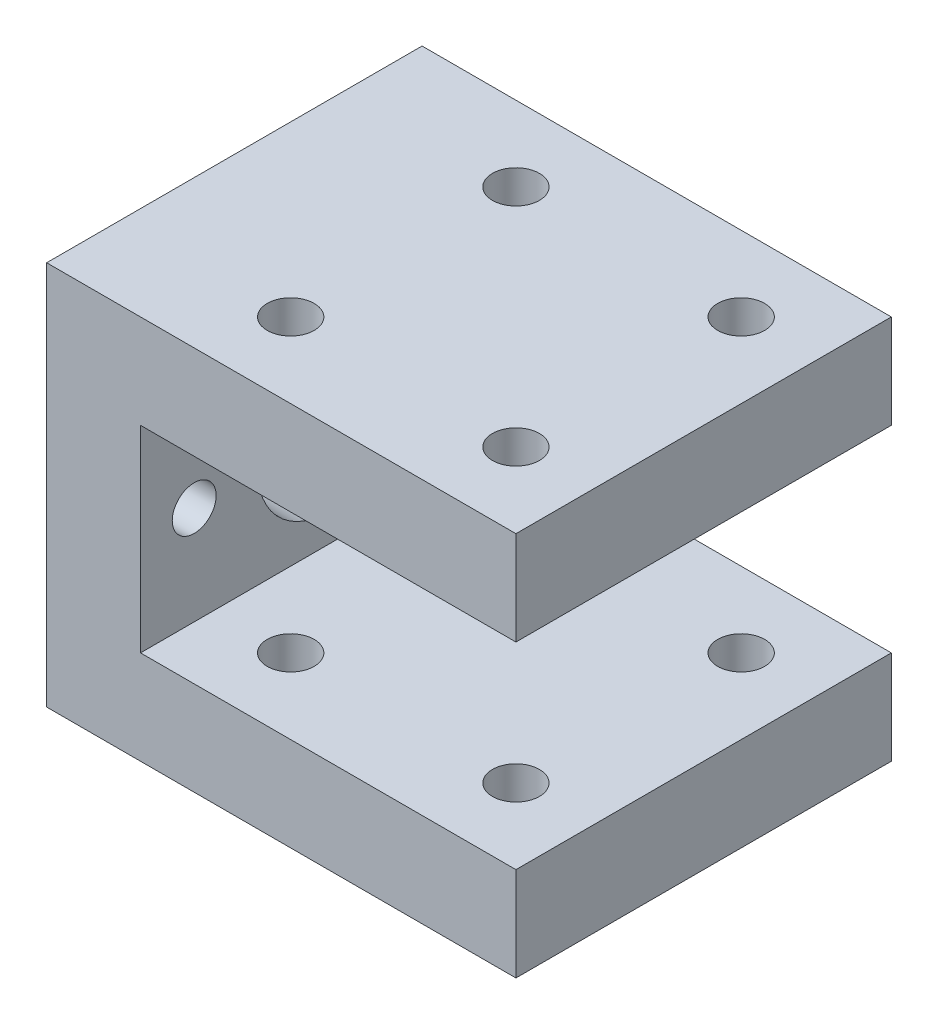
ISO-10303-21;
HEADER;
FILE_DESCRIPTION(('STEP AP214'),'2;1');
FILE_NAME('part.step','',(''),(''),'','','');
FILE_SCHEMA(('AUTOMOTIVE_DESIGN { 1 0 10303 214 1 1 1 1 }'));
ENDSEC;
DATA;
#1=APPLICATION_CONTEXT('core data for automotive mechanical design processes');
#2=APPLICATION_PROTOCOL_DEFINITION('international standard','automotive_design',2000,#1);
#3=PRODUCT_CONTEXT('',#1,'mechanical');
#4=PRODUCT('Part','Part','',(#3));
#5=PRODUCT_RELATED_PRODUCT_CATEGORY('part','',(#4));
#6=PRODUCT_DEFINITION_FORMATION('','',#4);
#7=PRODUCT_DEFINITION_CONTEXT('part definition',#1,'design');
#8=PRODUCT_DEFINITION('design','',#6,#7);
#9=PRODUCT_DEFINITION_SHAPE('','',#8);
#10=(LENGTH_UNIT() NAMED_UNIT(*) SI_UNIT(.MILLI.,.METRE.));
#11=(NAMED_UNIT(*) PLANE_ANGLE_UNIT() SI_UNIT($,.RADIAN.));
#12=(NAMED_UNIT(*) SI_UNIT($,.STERADIAN.) SOLID_ANGLE_UNIT());
#13=UNCERTAINTY_MEASURE_WITH_UNIT(LENGTH_MEASURE(1.E-05),#10,'distance_accuracy_value','');
#14=(GEOMETRIC_REPRESENTATION_CONTEXT(3) GLOBAL_UNCERTAINTY_ASSIGNED_CONTEXT((#13)) GLOBAL_UNIT_ASSIGNED_CONTEXT((#10,
#11,#12)) REPRESENTATION_CONTEXT('',''));
#15=CARTESIAN_POINT('',(0.,0.,0.));
#16=DIRECTION('',(0.,0.,1.));
#17=DIRECTION('',(1.,0.,0.));
#18=AXIS2_PLACEMENT_3D('',#15,#16,#17);
#19=CARTESIAN_POINT('',(10.,-21.,0.));
#20=DIRECTION('',(-1.,0.,0.));
#21=DIRECTION('',(0.,0.,1.));
#22=AXIS2_PLACEMENT_3D('',#19,#20,#21);
#23=PLANE('',#22);
#24=CARTESIAN_POINT('',(10.,-10.5,-20.));
#25=DIRECTION('',(-1.,0.,0.));
#26=DIRECTION('',(0.,0.,1.));
#27=AXIS2_PLACEMENT_3D('',#24,#25,#26);
#28=CIRCLE('',#27,7.5);
#29=CARTESIAN_POINT('',(10.,-10.5,-12.5));
#30=VERTEX_POINT('',#29);
#31=EDGE_CURVE('E136',#30,#30,#28,.T.);
#32=ORIENTED_EDGE('',*,*,#31,.T.);
#33=EDGE_LOOP('',(#32));
#34=FACE_BOUND('',#33,.T.);
#35=DIRECTION('',(0.,0.,1.));
#36=VECTOR('',#35,1.);
#37=CARTESIAN_POINT('',(10.,-21.,0.));
#38=LINE('',#37,#36);
#39=CARTESIAN_POINT('',(10.,-21.,-40.));
#40=VERTEX_POINT('',#39);
#41=CARTESIAN_POINT('',(10.,-21.,0.));
#42=VERTEX_POINT('',#41);
#43=EDGE_CURVE('E134',#40,#42,#38,.T.);
#44=ORIENTED_EDGE('',*,*,#43,.F.);
#45=DIRECTION('',(0.,1.,0.));
#46=VECTOR('',#45,1.);
#47=CARTESIAN_POINT('',(10.,-21.,-40.));
#48=LINE('',#47,#46);
#49=CARTESIAN_POINT('',(10.,0.,-40.));
#50=VERTEX_POINT('',#49);
#51=EDGE_CURVE('E49',#40,#50,#48,.T.);
#52=ORIENTED_EDGE('',*,*,#51,.T.);
#53=DIRECTION('',(0.,0.,1.));
#54=VECTOR('',#53,1.);
#55=CARTESIAN_POINT('',(10.,0.,0.));
#56=LINE('',#55,#54);
#57=CARTESIAN_POINT('',(10.,0.,0.));
#58=VERTEX_POINT('',#57);
#59=EDGE_CURVE('E119',#50,#58,#56,.T.);
#60=ORIENTED_EDGE('',*,*,#59,.T.);
#61=DIRECTION('',(0.,1.,0.));
#62=VECTOR('',#61,1.);
#63=CARTESIAN_POINT('',(10.,-21.,0.));
#64=LINE('',#63,#62);
#65=EDGE_CURVE('E157',#42,#58,#64,.T.);
#66=ORIENTED_EDGE('',*,*,#65,.F.);
#67=EDGE_LOOP('',(#44,#52,#60,#66));
#68=FACE_BOUND('',#67,.T.);
#69=CARTESIAN_POINT('',(10.,-10.5,-34.28));
#70=DIRECTION('',(-1.,0.,0.));
#71=DIRECTION('',(0.,0.,1.));
#72=AXIS2_PLACEMENT_3D('',#69,#70,#71);
#73=CIRCLE('',#72,2.34);
#74=CARTESIAN_POINT('',(10.,-10.5,-31.94));
#75=VERTEX_POINT('',#74);
#76=EDGE_CURVE('E424',#75,#75,#73,.T.);
#77=ORIENTED_EDGE('',*,*,#76,.T.);
#78=EDGE_LOOP('',(#77));
#79=FACE_BOUND('',#78,.T.);
#80=CARTESIAN_POINT('',(10.,-10.5,-5.72));
#81=DIRECTION('',(-1.,0.,0.));
#82=DIRECTION('',(0.,0.,1.));
#83=AXIS2_PLACEMENT_3D('',#80,#81,#82);
#84=CIRCLE('',#83,2.34);
#85=CARTESIAN_POINT('',(10.,-10.5,-3.38));
#86=VERTEX_POINT('',#85);
#87=EDGE_CURVE('E415',#86,#86,#84,.T.);
#88=ORIENTED_EDGE('',*,*,#87,.T.);
#89=EDGE_LOOP('',(#88));
#90=FACE_BOUND('',#89,.T.);
#91=ADVANCED_FACE('F32',(#34,#68,#79,#90),#23,.F.);
#92=CARTESIAN_POINT('',(0.,10.,0.));
#93=DIRECTION('',(1.,0.,0.));
#94=DIRECTION('',(0.,0.,-1.));
#95=AXIS2_PLACEMENT_3D('',#92,#93,#94);
#96=PLANE('',#95);
#97=CARTESIAN_POINT('',(0.,-10.5,-20.));
#98=DIRECTION('',(-1.,0.,0.));
#99=DIRECTION('',(0.,0.,1.));
#100=AXIS2_PLACEMENT_3D('',#97,#98,#99);
#101=CIRCLE('',#100,7.5);
#102=CARTESIAN_POINT('',(0.,-10.5,-12.5));
#103=VERTEX_POINT('',#102);
#104=EDGE_CURVE('E208',#103,#103,#101,.T.);
#105=ORIENTED_EDGE('',*,*,#104,.F.);
#106=EDGE_LOOP('',(#105));
#107=FACE_BOUND('',#106,.T.);
#108=DIRECTION('',(0.,-1.,0.));
#109=VECTOR('',#108,1.);
#110=CARTESIAN_POINT('',(0.,10.,-40.));
#111=LINE('',#110,#109);
#112=CARTESIAN_POINT('',(0.,10.,-40.));
#113=VERTEX_POINT('',#112);
#114=CARTESIAN_POINT('',(0.,-31.,-40.));
#115=VERTEX_POINT('',#114);
#116=EDGE_CURVE('E459',#113,#115,#111,.T.);
#117=ORIENTED_EDGE('',*,*,#116,.T.);
#118=DIRECTION('',(0.,0.,-1.));
#119=VECTOR('',#118,1.);
#120=CARTESIAN_POINT('',(0.,-31.,0.));
#121=LINE('',#120,#119);
#122=CARTESIAN_POINT('',(0.,-31.,0.));
#123=VERTEX_POINT('',#122);
#124=EDGE_CURVE('E147',#123,#115,#121,.T.);
#125=ORIENTED_EDGE('',*,*,#124,.F.);
#126=DIRECTION('',(0.,-1.,0.));
#127=VECTOR('',#126,1.);
#128=CARTESIAN_POINT('',(0.,10.,0.));
#129=LINE('',#128,#127);
#130=CARTESIAN_POINT('',(0.,10.,0.));
#131=VERTEX_POINT('',#130);
#132=EDGE_CURVE('E11',#131,#123,#129,.T.);
#133=ORIENTED_EDGE('',*,*,#132,.F.);
#134=DIRECTION('',(0.,0.,1.));
#135=VECTOR('',#134,1.);
#136=CARTESIAN_POINT('',(0.,10.,0.));
#137=LINE('',#136,#135);
#138=EDGE_CURVE('E152',#113,#131,#137,.T.);
#139=ORIENTED_EDGE('',*,*,#138,.F.);
#140=EDGE_LOOP('',(#117,#125,#133,#139));
#141=FACE_BOUND('',#140,.T.);
#142=CARTESIAN_POINT('',(0.,-10.5,-34.28));
#143=DIRECTION('',(-1.,0.,0.));
#144=DIRECTION('',(0.,0.,1.));
#145=AXIS2_PLACEMENT_3D('',#142,#143,#144);
#146=CIRCLE('',#145,2.34);
#147=CARTESIAN_POINT('',(0.,-10.5,-31.94));
#148=VERTEX_POINT('',#147);
#149=EDGE_CURVE('E421',#148,#148,#146,.T.);
#150=ORIENTED_EDGE('',*,*,#149,.F.);
#151=EDGE_LOOP('',(#150));
#152=FACE_BOUND('',#151,.T.);
#153=CARTESIAN_POINT('',(0.,-10.5,-5.72));
#154=DIRECTION('',(-1.,0.,0.));
#155=DIRECTION('',(0.,0.,1.));
#156=AXIS2_PLACEMENT_3D('',#153,#154,#155);
#157=CIRCLE('',#156,2.34);
#158=CARTESIAN_POINT('',(0.,-10.5,-3.38));
#159=VERTEX_POINT('',#158);
#160=EDGE_CURVE('E418',#159,#159,#157,.T.);
#161=ORIENTED_EDGE('',*,*,#160,.F.);
#162=EDGE_LOOP('',(#161));
#163=FACE_BOUND('',#162,.T.);
#164=ADVANCED_FACE('F34',(#107,#141,#152,#163),#96,.F.);
#165=CARTESIAN_POINT('',(0.,10.,0.));
#166=DIRECTION('',(0.,0.,-1.));
#167=DIRECTION('',(-1.,0.,0.));
#168=AXIS2_PLACEMENT_3D('',#165,#166,#167);
#169=PLANE('',#168);
#170=ORIENTED_EDGE('',*,*,#132,.T.);
#171=DIRECTION('',(-1.,0.,0.));
#172=VECTOR('',#171,1.);
#173=CARTESIAN_POINT('',(0.,-31.,0.));
#174=LINE('',#173,#172);
#175=CARTESIAN_POINT('',(50.,-31.,0.));
#176=VERTEX_POINT('',#175);
#177=EDGE_CURVE('E109',#176,#123,#174,.T.);
#178=ORIENTED_EDGE('',*,*,#177,.F.);
#179=DIRECTION('',(0.,-1.,0.));
#180=VECTOR('',#179,1.);
#181=CARTESIAN_POINT('',(50.,-31.,0.));
#182=LINE('',#181,#180);
#183=CARTESIAN_POINT('',(50.,-21.,0.));
#184=VERTEX_POINT('',#183);
#185=EDGE_CURVE('E114',#184,#176,#182,.T.);
#186=ORIENTED_EDGE('',*,*,#185,.F.);
#187=DIRECTION('',(-1.,0.,0.));
#188=VECTOR('',#187,1.);
#189=CARTESIAN_POINT('',(50.,-21.,0.));
#190=LINE('',#189,#188);
#191=EDGE_CURVE('E142',#184,#42,#190,.T.);
#192=ORIENTED_EDGE('',*,*,#191,.T.);
#193=ORIENTED_EDGE('',*,*,#65,.T.);
#194=DIRECTION('',(1.,0.,0.));
#195=VECTOR('',#194,1.);
#196=CARTESIAN_POINT('',(0.,0.,0.));
#197=LINE('',#196,#195);
#198=CARTESIAN_POINT('',(50.,0.,0.));
#199=VERTEX_POINT('',#198);
#200=EDGE_CURVE('E158',#58,#199,#197,.T.);
#201=ORIENTED_EDGE('',*,*,#200,.T.);
#202=DIRECTION('',(0.,-1.,0.));
#203=VECTOR('',#202,1.);
#204=CARTESIAN_POINT('',(50.,10.,0.));
#205=LINE('',#204,#203);
#206=CARTESIAN_POINT('',(50.,10.,0.));
#207=VERTEX_POINT('',#206);
#208=EDGE_CURVE('E41',#207,#199,#205,.T.);
#209=ORIENTED_EDGE('',*,*,#208,.F.);
#210=DIRECTION('',(1.,0.,0.));
#211=VECTOR('',#210,1.);
#212=CARTESIAN_POINT('',(0.,10.,0.));
#213=LINE('',#212,#211);
#214=EDGE_CURVE('E81',#131,#207,#213,.T.);
#215=ORIENTED_EDGE('',*,*,#214,.F.);
#216=EDGE_LOOP('',(#170,#178,#186,#192,#193,#201,#209,#215));
#217=FACE_BOUND('',#216,.T.);
#218=ADVANCED_FACE('F111',(#217),#169,.F.);
#219=CARTESIAN_POINT('',(50.,10.,0.));
#220=DIRECTION('',(-1.,0.,0.));
#221=DIRECTION('',(0.,0.,1.));
#222=AXIS2_PLACEMENT_3D('',#219,#220,#221);
#223=PLANE('',#222);
#224=DIRECTION('',(0.,0.,-1.));
#225=VECTOR('',#224,1.);
#226=CARTESIAN_POINT('',(50.,0.,0.));
#227=LINE('',#226,#225);
#228=CARTESIAN_POINT('',(50.,0.,-40.));
#229=VERTEX_POINT('',#228);
#230=EDGE_CURVE('E74',#199,#229,#227,.T.);
#231=ORIENTED_EDGE('',*,*,#230,.T.);
#232=DIRECTION('',(0.,-1.,0.));
#233=VECTOR('',#232,1.);
#234=CARTESIAN_POINT('',(50.,10.,-40.));
#235=LINE('',#234,#233);
#236=CARTESIAN_POINT('',(50.,10.,-40.));
#237=VERTEX_POINT('',#236);
#238=EDGE_CURVE('E453',#237,#229,#235,.T.);
#239=ORIENTED_EDGE('',*,*,#238,.F.);
#240=DIRECTION('',(0.,0.,-1.));
#241=VECTOR('',#240,1.);
#242=CARTESIAN_POINT('',(50.,10.,0.));
#243=LINE('',#242,#241);
#244=EDGE_CURVE('E462',#207,#237,#243,.T.);
#245=ORIENTED_EDGE('',*,*,#244,.F.);
#246=ORIENTED_EDGE('',*,*,#208,.T.);
#247=EDGE_LOOP('',(#231,#239,#245,#246));
#248=FACE_BOUND('',#247,.T.);
#249=ADVANCED_FACE('F249',(#248),#223,.F.);
#250=CARTESIAN_POINT('',(0.,10.,-40.));
#251=DIRECTION('',(0.,0.,1.));
#252=DIRECTION('',(1.,0.,0.));
#253=AXIS2_PLACEMENT_3D('',#250,#251,#252);
#254=PLANE('',#253);
#255=DIRECTION('',(-1.,0.,0.));
#256=VECTOR('',#255,1.);
#257=CARTESIAN_POINT('',(0.,0.,-40.));
#258=LINE('',#257,#256);
#259=EDGE_CURVE('E452',#229,#50,#258,.T.);
#260=ORIENTED_EDGE('',*,*,#259,.T.);
#261=ORIENTED_EDGE('',*,*,#51,.F.);
#262=DIRECTION('',(-1.,0.,0.));
#263=VECTOR('',#262,1.);
#264=CARTESIAN_POINT('',(50.,-21.,-40.));
#265=LINE('',#264,#263);
#266=CARTESIAN_POINT('',(50.,-21.,-40.));
#267=VERTEX_POINT('',#266);
#268=EDGE_CURVE('E145',#267,#40,#265,.T.);
#269=ORIENTED_EDGE('',*,*,#268,.F.);
#270=DIRECTION('',(0.,1.,0.));
#271=VECTOR('',#270,1.);
#272=CARTESIAN_POINT('',(50.,-31.,-40.));
#273=LINE('',#272,#271);
#274=CARTESIAN_POINT('',(50.,-31.,-40.));
#275=VERTEX_POINT('',#274);
#276=EDGE_CURVE('E128',#275,#267,#273,.T.);
#277=ORIENTED_EDGE('',*,*,#276,.F.);
#278=DIRECTION('',(1.,0.,0.));
#279=VECTOR('',#278,1.);
#280=CARTESIAN_POINT('',(0.,-31.,-40.));
#281=LINE('',#280,#279);
#282=EDGE_CURVE('E120',#115,#275,#281,.T.);
#283=ORIENTED_EDGE('',*,*,#282,.F.);
#284=ORIENTED_EDGE('',*,*,#116,.F.);
#285=DIRECTION('',(-1.,0.,0.));
#286=VECTOR('',#285,1.);
#287=CARTESIAN_POINT('',(0.,10.,-40.));
#288=LINE('',#287,#286);
#289=EDGE_CURVE('E58',#237,#113,#288,.T.);
#290=ORIENTED_EDGE('',*,*,#289,.F.);
#291=ORIENTED_EDGE('',*,*,#238,.T.);
#292=EDGE_LOOP('',(#260,#261,#269,#277,#283,#284,#290,#291));
#293=FACE_BOUND('',#292,.T.);
#294=ADVANCED_FACE('F242',(#293),#254,.F.);
#295=CARTESIAN_POINT('',(0.,10.,0.));
#296=DIRECTION('',(0.,-1.,0.));
#297=DIRECTION('',(0.,0.,-1.));
#298=AXIS2_PLACEMENT_3D('',#295,#296,#297);
#299=PLANE('',#298);
#300=CARTESIAN_POINT('',(42.,10.,-32.));
#301=DIRECTION('',(0.,-1.,0.));
#302=DIRECTION('',(0.,0.,-1.));
#303=AXIS2_PLACEMENT_3D('',#300,#301,#302);
#304=CIRCLE('',#303,2.5);
#305=CARTESIAN_POINT('',(42.,10.,-34.5));
#306=VERTEX_POINT('',#305);
#307=EDGE_CURVE('E430',#306,#306,#304,.T.);
#308=ORIENTED_EDGE('',*,*,#307,.T.);
#309=EDGE_LOOP('',(#308));
#310=FACE_BOUND('',#309,.T.);
#311=CARTESIAN_POINT('',(18.,10.,-32.));
#312=DIRECTION('',(0.,-1.,0.));
#313=DIRECTION('',(0.,0.,-1.));
#314=AXIS2_PLACEMENT_3D('',#311,#312,#313);
#315=CIRCLE('',#314,2.5);
#316=CARTESIAN_POINT('',(18.,10.,-34.5));
#317=VERTEX_POINT('',#316);
#318=EDGE_CURVE('E179',#317,#317,#315,.T.);
#319=ORIENTED_EDGE('',*,*,#318,.T.);
#320=EDGE_LOOP('',(#319));
#321=FACE_BOUND('',#320,.T.);
#322=CARTESIAN_POINT('',(42.,10.,-7.99999999999999));
#323=DIRECTION('',(0.,-1.,0.));
#324=DIRECTION('',(0.,0.,-1.));
#325=AXIS2_PLACEMENT_3D('',#322,#323,#324);
#326=CIRCLE('',#325,2.5);
#327=CARTESIAN_POINT('',(42.,10.,-10.5));
#328=VERTEX_POINT('',#327);
#329=EDGE_CURVE('E175',#328,#328,#326,.T.);
#330=ORIENTED_EDGE('',*,*,#329,.T.);
#331=EDGE_LOOP('',(#330));
#332=FACE_BOUND('',#331,.T.);
#333=CARTESIAN_POINT('',(18.,10.,-7.99999999999999));
#334=DIRECTION('',(0.,-1.,0.));
#335=DIRECTION('',(0.,0.,-1.));
#336=AXIS2_PLACEMENT_3D('',#333,#334,#335);
#337=CIRCLE('',#336,2.5);
#338=CARTESIAN_POINT('',(18.,10.,-10.5));
#339=VERTEX_POINT('',#338);
#340=EDGE_CURVE('E171',#339,#339,#337,.T.);
#341=ORIENTED_EDGE('',*,*,#340,.T.);
#342=EDGE_LOOP('',(#341));
#343=FACE_BOUND('',#342,.T.);
#344=ORIENTED_EDGE('',*,*,#138,.T.);
#345=ORIENTED_EDGE('',*,*,#214,.T.);
#346=ORIENTED_EDGE('',*,*,#244,.T.);
#347=ORIENTED_EDGE('',*,*,#289,.T.);
#348=EDGE_LOOP('',(#344,#345,#346,#347));
#349=FACE_BOUND('',#348,.T.);
#350=ADVANCED_FACE('F238',(#310,#321,#332,#343,#349),#299,.F.);
#351=CARTESIAN_POINT('',(0.,0.,0.));
#352=DIRECTION('',(0.,-1.,0.));
#353=DIRECTION('',(0.,0.,-1.));
#354=AXIS2_PLACEMENT_3D('',#351,#352,#353);
#355=PLANE('',#354);
#356=CARTESIAN_POINT('',(42.,0.,-32.));
#357=DIRECTION('',(0.,-1.,0.));
#358=DIRECTION('',(0.,0.,-1.));
#359=AXIS2_PLACEMENT_3D('',#356,#357,#358);
#360=CIRCLE('',#359,2.5);
#361=CARTESIAN_POINT('',(42.,0.,-34.5));
#362=VERTEX_POINT('',#361);
#363=EDGE_CURVE('E191',#362,#362,#360,.T.);
#364=ORIENTED_EDGE('',*,*,#363,.F.);
#365=EDGE_LOOP('',(#364));
#366=FACE_BOUND('',#365,.T.);
#367=CARTESIAN_POINT('',(18.,0.,-32.));
#368=DIRECTION('',(0.,-1.,0.));
#369=DIRECTION('',(0.,0.,-1.));
#370=AXIS2_PLACEMENT_3D('',#367,#368,#369);
#371=CIRCLE('',#370,2.5);
#372=CARTESIAN_POINT('',(18.,0.,-34.5));
#373=VERTEX_POINT('',#372);
#374=EDGE_CURVE('E178',#373,#373,#371,.T.);
#375=ORIENTED_EDGE('',*,*,#374,.F.);
#376=EDGE_LOOP('',(#375));
#377=FACE_BOUND('',#376,.T.);
#378=CARTESIAN_POINT('',(42.,0.,-7.99999999999999));
#379=DIRECTION('',(0.,-1.,0.));
#380=DIRECTION('',(0.,0.,-1.));
#381=AXIS2_PLACEMENT_3D('',#378,#379,#380);
#382=CIRCLE('',#381,2.5);
#383=CARTESIAN_POINT('',(42.,0.,-10.5));
#384=VERTEX_POINT('',#383);
#385=EDGE_CURVE('E174',#384,#384,#382,.T.);
#386=ORIENTED_EDGE('',*,*,#385,.F.);
#387=EDGE_LOOP('',(#386));
#388=FACE_BOUND('',#387,.T.);
#389=CARTESIAN_POINT('',(18.,0.,-7.99999999999999));
#390=DIRECTION('',(0.,-1.,0.));
#391=DIRECTION('',(0.,0.,-1.));
#392=AXIS2_PLACEMENT_3D('',#389,#390,#391);
#393=CIRCLE('',#392,2.5);
#394=CARTESIAN_POINT('',(18.,0.,-10.5));
#395=VERTEX_POINT('',#394);
#396=EDGE_CURVE('E170',#395,#395,#393,.T.);
#397=ORIENTED_EDGE('',*,*,#396,.F.);
#398=EDGE_LOOP('',(#397));
#399=FACE_BOUND('',#398,.T.);
#400=ORIENTED_EDGE('',*,*,#59,.F.);
#401=ORIENTED_EDGE('',*,*,#259,.F.);
#402=ORIENTED_EDGE('',*,*,#230,.F.);
#403=ORIENTED_EDGE('',*,*,#200,.F.);
#404=EDGE_LOOP('',(#400,#401,#402,#403));
#405=FACE_BOUND('',#404,.T.);
#406=ADVANCED_FACE('F241',(#366,#377,#388,#399,#405),#355,.T.);
#407=CARTESIAN_POINT('',(0.,-31.,0.));
#408=DIRECTION('',(0.,-1.,0.));
#409=DIRECTION('',(0.,0.,-1.));
#410=AXIS2_PLACEMENT_3D('',#407,#408,#409);
#411=PLANE('',#410);
#412=CARTESIAN_POINT('',(42.,-31.,-32.));
#413=DIRECTION('',(0.,-1.,0.));
#414=DIRECTION('',(0.,0.,-1.));
#415=AXIS2_PLACEMENT_3D('',#412,#413,#414);
#416=CIRCLE('',#415,2.5);
#417=CARTESIAN_POINT('',(42.,-31.,-34.5));
#418=VERTEX_POINT('',#417);
#419=EDGE_CURVE('E427',#418,#418,#416,.T.);
#420=ORIENTED_EDGE('',*,*,#419,.F.);
#421=EDGE_LOOP('',(#420));
#422=FACE_BOUND('',#421,.T.);
#423=CARTESIAN_POINT('',(18.,-31.,-32.));
#424=DIRECTION('',(0.,-1.,0.));
#425=DIRECTION('',(0.,0.,-1.));
#426=AXIS2_PLACEMENT_3D('',#423,#424,#425);
#427=CIRCLE('',#426,2.5);
#428=CARTESIAN_POINT('',(18.,-31.,-34.5));
#429=VERTEX_POINT('',#428);
#430=EDGE_CURVE('E186',#429,#429,#427,.T.);
#431=ORIENTED_EDGE('',*,*,#430,.F.);
#432=EDGE_LOOP('',(#431));
#433=FACE_BOUND('',#432,.T.);
#434=CARTESIAN_POINT('',(42.,-31.,-7.99999999999999));
#435=DIRECTION('',(0.,-1.,0.));
#436=DIRECTION('',(0.,0.,-1.));
#437=AXIS2_PLACEMENT_3D('',#434,#435,#436);
#438=CIRCLE('',#437,2.5);
#439=CARTESIAN_POINT('',(42.,-31.,-10.5));
#440=VERTEX_POINT('',#439);
#441=EDGE_CURVE('E183',#440,#440,#438,.T.);
#442=ORIENTED_EDGE('',*,*,#441,.F.);
#443=EDGE_LOOP('',(#442));
#444=FACE_BOUND('',#443,.T.);
#445=CARTESIAN_POINT('',(18.,-31.,-7.99999999999999));
#446=DIRECTION('',(0.,-1.,0.));
#447=DIRECTION('',(0.,0.,-1.));
#448=AXIS2_PLACEMENT_3D('',#445,#446,#447);
#449=CIRCLE('',#448,2.5);
#450=CARTESIAN_POINT('',(18.,-31.,-10.5));
#451=VERTEX_POINT('',#450);
#452=EDGE_CURVE('E202',#451,#451,#449,.T.);
#453=ORIENTED_EDGE('',*,*,#452,.F.);
#454=EDGE_LOOP('',(#453));
#455=FACE_BOUND('',#454,.T.);
#456=ORIENTED_EDGE('',*,*,#124,.T.);
#457=ORIENTED_EDGE('',*,*,#282,.T.);
#458=DIRECTION('',(0.,0.,-1.));
#459=VECTOR('',#458,1.);
#460=CARTESIAN_POINT('',(50.,-31.,0.));
#461=LINE('',#460,#459);
#462=EDGE_CURVE('E123',#176,#275,#461,.T.);
#463=ORIENTED_EDGE('',*,*,#462,.F.);
#464=ORIENTED_EDGE('',*,*,#177,.T.);
#465=EDGE_LOOP('',(#456,#457,#463,#464));
#466=FACE_BOUND('',#465,.T.);
#467=ADVANCED_FACE('F124',(#422,#433,#444,#455,#466),#411,.T.);
#468=CARTESIAN_POINT('',(50.,-21.,0.));
#469=DIRECTION('',(0.,-1.,0.));
#470=DIRECTION('',(0.,0.,-1.));
#471=AXIS2_PLACEMENT_3D('',#468,#469,#470);
#472=PLANE('',#471);
#473=CARTESIAN_POINT('',(42.,-21.,-32.));
#474=DIRECTION('',(0.,-1.,0.));
#475=DIRECTION('',(0.,0.,-1.));
#476=AXIS2_PLACEMENT_3D('',#473,#474,#475);
#477=CIRCLE('',#476,2.5);
#478=CARTESIAN_POINT('',(42.,-21.,-34.5));
#479=VERTEX_POINT('',#478);
#480=EDGE_CURVE('E36',#479,#479,#477,.T.);
#481=ORIENTED_EDGE('',*,*,#480,.T.);
#482=EDGE_LOOP('',(#481));
#483=FACE_BOUND('',#482,.T.);
#484=CARTESIAN_POINT('',(18.,-21.,-32.));
#485=DIRECTION('',(0.,-1.,0.));
#486=DIRECTION('',(0.,0.,-1.));
#487=AXIS2_PLACEMENT_3D('',#484,#485,#486);
#488=CIRCLE('',#487,2.5);
#489=CARTESIAN_POINT('',(18.,-21.,-34.5));
#490=VERTEX_POINT('',#489);
#491=EDGE_CURVE('E176',#490,#490,#488,.T.);
#492=ORIENTED_EDGE('',*,*,#491,.T.);
#493=EDGE_LOOP('',(#492));
#494=FACE_BOUND('',#493,.T.);
#495=CARTESIAN_POINT('',(42.,-21.,-7.99999999999999));
#496=DIRECTION('',(0.,-1.,0.));
#497=DIRECTION('',(0.,0.,-1.));
#498=AXIS2_PLACEMENT_3D('',#495,#496,#497);
#499=CIRCLE('',#498,2.5);
#500=CARTESIAN_POINT('',(42.,-21.,-10.5));
#501=VERTEX_POINT('',#500);
#502=EDGE_CURVE('E172',#501,#501,#499,.T.);
#503=ORIENTED_EDGE('',*,*,#502,.T.);
#504=EDGE_LOOP('',(#503));
#505=FACE_BOUND('',#504,.T.);
#506=CARTESIAN_POINT('',(18.,-21.,-7.99999999999999));
#507=DIRECTION('',(0.,-1.,0.));
#508=DIRECTION('',(0.,0.,-1.));
#509=AXIS2_PLACEMENT_3D('',#506,#507,#508);
#510=CIRCLE('',#509,2.5);
#511=CARTESIAN_POINT('',(18.,-21.,-10.5));
#512=VERTEX_POINT('',#511);
#513=EDGE_CURVE('E167',#512,#512,#510,.T.);
#514=ORIENTED_EDGE('',*,*,#513,.T.);
#515=EDGE_LOOP('',(#514));
#516=FACE_BOUND('',#515,.T.);
#517=ORIENTED_EDGE('',*,*,#43,.T.);
#518=ORIENTED_EDGE('',*,*,#191,.F.);
#519=DIRECTION('',(0.,0.,1.));
#520=VECTOR('',#519,1.);
#521=CARTESIAN_POINT('',(50.,-21.,0.));
#522=LINE('',#521,#520);
#523=EDGE_CURVE('E132',#267,#184,#522,.T.);
#524=ORIENTED_EDGE('',*,*,#523,.F.);
#525=ORIENTED_EDGE('',*,*,#268,.T.);
#526=EDGE_LOOP('',(#517,#518,#524,#525));
#527=FACE_BOUND('',#526,.T.);
#528=ADVANCED_FACE('F227',(#483,#494,#505,#516,#527),#472,.F.);
#529=CARTESIAN_POINT('',(50.,0.,0.));
#530=DIRECTION('',(-1.,0.,0.));
#531=DIRECTION('',(0.,0.,1.));
#532=AXIS2_PLACEMENT_3D('',#529,#530,#531);
#533=PLANE('',#532);
#534=ORIENTED_EDGE('',*,*,#185,.T.);
#535=ORIENTED_EDGE('',*,*,#462,.T.);
#536=ORIENTED_EDGE('',*,*,#276,.T.);
#537=ORIENTED_EDGE('',*,*,#523,.T.);
#538=EDGE_LOOP('',(#534,#535,#536,#537));
#539=FACE_BOUND('',#538,.T.);
#540=ADVANCED_FACE('F130',(#539),#533,.F.);
#541=CARTESIAN_POINT('',(40.,-10.5,-20.));
#542=DIRECTION('',(-1.,0.,0.));
#543=DIRECTION('',(0.,0.,1.));
#544=AXIS2_PLACEMENT_3D('',#541,#542,#543);
#545=CYLINDRICAL_SURFACE('',#544,7.5);
#546=ORIENTED_EDGE('',*,*,#104,.T.);
#547=EDGE_LOOP('',(#546));
#548=FACE_BOUND('',#547,.T.);
#549=ORIENTED_EDGE('',*,*,#31,.F.);
#550=EDGE_LOOP('',(#549));
#551=FACE_BOUND('',#550,.T.);
#552=ADVANCED_FACE('F216',(#548,#551),#545,.F.);
#553=CARTESIAN_POINT('',(18.,10.,-7.99999999999999));
#554=DIRECTION('',(0.,-1.,0.));
#555=DIRECTION('',(0.,0.,-1.));
#556=AXIS2_PLACEMENT_3D('',#553,#554,#555);
#557=CYLINDRICAL_SURFACE('',#556,2.5);
#558=ORIENTED_EDGE('',*,*,#452,.T.);
#559=EDGE_LOOP('',(#558));
#560=FACE_BOUND('',#559,.T.);
#561=ORIENTED_EDGE('',*,*,#513,.F.);
#562=EDGE_LOOP('',(#561));
#563=FACE_BOUND('',#562,.T.);
#564=ADVANCED_FACE('F218',(#560,#563),#557,.F.);
#565=ORIENTED_EDGE('',*,*,#396,.T.);
#566=EDGE_LOOP('',(#565));
#567=FACE_BOUND('',#566,.T.);
#568=ORIENTED_EDGE('',*,*,#340,.F.);
#569=EDGE_LOOP('',(#568));
#570=FACE_BOUND('',#569,.T.);
#571=ADVANCED_FACE('F224',(#567,#570),#557,.F.);
#572=CARTESIAN_POINT('',(42.,10.,-7.99999999999999));
#573=DIRECTION('',(0.,-1.,0.));
#574=DIRECTION('',(0.,0.,-1.));
#575=AXIS2_PLACEMENT_3D('',#572,#573,#574);
#576=CYLINDRICAL_SURFACE('',#575,2.5);
#577=ORIENTED_EDGE('',*,*,#441,.T.);
#578=EDGE_LOOP('',(#577));
#579=FACE_BOUND('',#578,.T.);
#580=ORIENTED_EDGE('',*,*,#502,.F.);
#581=EDGE_LOOP('',(#580));
#582=FACE_BOUND('',#581,.T.);
#583=ADVANCED_FACE('F308',(#579,#582),#576,.F.);
#584=ORIENTED_EDGE('',*,*,#385,.T.);
#585=EDGE_LOOP('',(#584));
#586=FACE_BOUND('',#585,.T.);
#587=ORIENTED_EDGE('',*,*,#329,.F.);
#588=EDGE_LOOP('',(#587));
#589=FACE_BOUND('',#588,.T.);
#590=ADVANCED_FACE('F316',(#586,#589),#576,.F.);
#591=CARTESIAN_POINT('',(18.,10.,-32.));
#592=DIRECTION('',(0.,-1.,0.));
#593=DIRECTION('',(0.,0.,-1.));
#594=AXIS2_PLACEMENT_3D('',#591,#592,#593);
#595=CYLINDRICAL_SURFACE('',#594,2.5);
#596=ORIENTED_EDGE('',*,*,#430,.T.);
#597=EDGE_LOOP('',(#596));
#598=FACE_BOUND('',#597,.T.);
#599=ORIENTED_EDGE('',*,*,#491,.F.);
#600=EDGE_LOOP('',(#599));
#601=FACE_BOUND('',#600,.T.);
#602=ADVANCED_FACE('F325',(#598,#601),#595,.F.);
#603=ORIENTED_EDGE('',*,*,#374,.T.);
#604=EDGE_LOOP('',(#603));
#605=FACE_BOUND('',#604,.T.);
#606=ORIENTED_EDGE('',*,*,#318,.F.);
#607=EDGE_LOOP('',(#606));
#608=FACE_BOUND('',#607,.T.);
#609=ADVANCED_FACE('F333',(#605,#608),#595,.F.);
#610=CARTESIAN_POINT('',(42.,10.,-32.));
#611=DIRECTION('',(0.,-1.,0.));
#612=DIRECTION('',(0.,0.,-1.));
#613=AXIS2_PLACEMENT_3D('',#610,#611,#612);
#614=CYLINDRICAL_SURFACE('',#613,2.5);
#615=ORIENTED_EDGE('',*,*,#419,.T.);
#616=EDGE_LOOP('',(#615));
#617=FACE_BOUND('',#616,.T.);
#618=ORIENTED_EDGE('',*,*,#480,.F.);
#619=EDGE_LOOP('',(#618));
#620=FACE_BOUND('',#619,.T.);
#621=ADVANCED_FACE('F342',(#617,#620),#614,.F.);
#622=ORIENTED_EDGE('',*,*,#363,.T.);
#623=EDGE_LOOP('',(#622));
#624=FACE_BOUND('',#623,.T.);
#625=ORIENTED_EDGE('',*,*,#307,.F.);
#626=EDGE_LOOP('',(#625));
#627=FACE_BOUND('',#626,.T.);
#628=ADVANCED_FACE('F350',(#624,#627),#614,.F.);
#629=CARTESIAN_POINT('',(10.,-10.5,-34.28));
#630=DIRECTION('',(-1.,0.,0.));
#631=DIRECTION('',(0.,0.,1.));
#632=AXIS2_PLACEMENT_3D('',#629,#630,#631);
#633=CYLINDRICAL_SURFACE('',#632,2.34);
#634=ORIENTED_EDGE('',*,*,#76,.F.);
#635=EDGE_LOOP('',(#634));
#636=FACE_BOUND('',#635,.T.);
#637=ORIENTED_EDGE('',*,*,#149,.T.);
#638=EDGE_LOOP('',(#637));
#639=FACE_BOUND('',#638,.T.);
#640=ADVANCED_FACE('F359',(#636,#639),#633,.F.);
#641=CARTESIAN_POINT('',(10.,-10.5,-5.72));
#642=DIRECTION('',(-1.,0.,0.));
#643=DIRECTION('',(0.,0.,1.));
#644=AXIS2_PLACEMENT_3D('',#641,#642,#643);
#645=CYLINDRICAL_SURFACE('',#644,2.34);
#646=ORIENTED_EDGE('',*,*,#87,.F.);
#647=EDGE_LOOP('',(#646));
#648=FACE_BOUND('',#647,.T.);
#649=ORIENTED_EDGE('',*,*,#160,.T.);
#650=EDGE_LOOP('',(#649));
#651=FACE_BOUND('',#650,.T.);
#652=ADVANCED_FACE('F391',(#648,#651),#645,.F.);
#653=CLOSED_SHELL('',(#91,#164,#218,#249,#294,#350,#406,#467,#528,#540,#552,#564,#571,#583,#590,
#602,#609,#621,#628,#640,#652));
#654=MANIFOLD_SOLID_BREP('B2',#653);
#655=ADVANCED_BREP_SHAPE_REPRESENTATION('',(#18,#654),#14);
#656=SHAPE_DEFINITION_REPRESENTATION(#9,#655);
ENDSEC;
END-ISO-10303-21;
